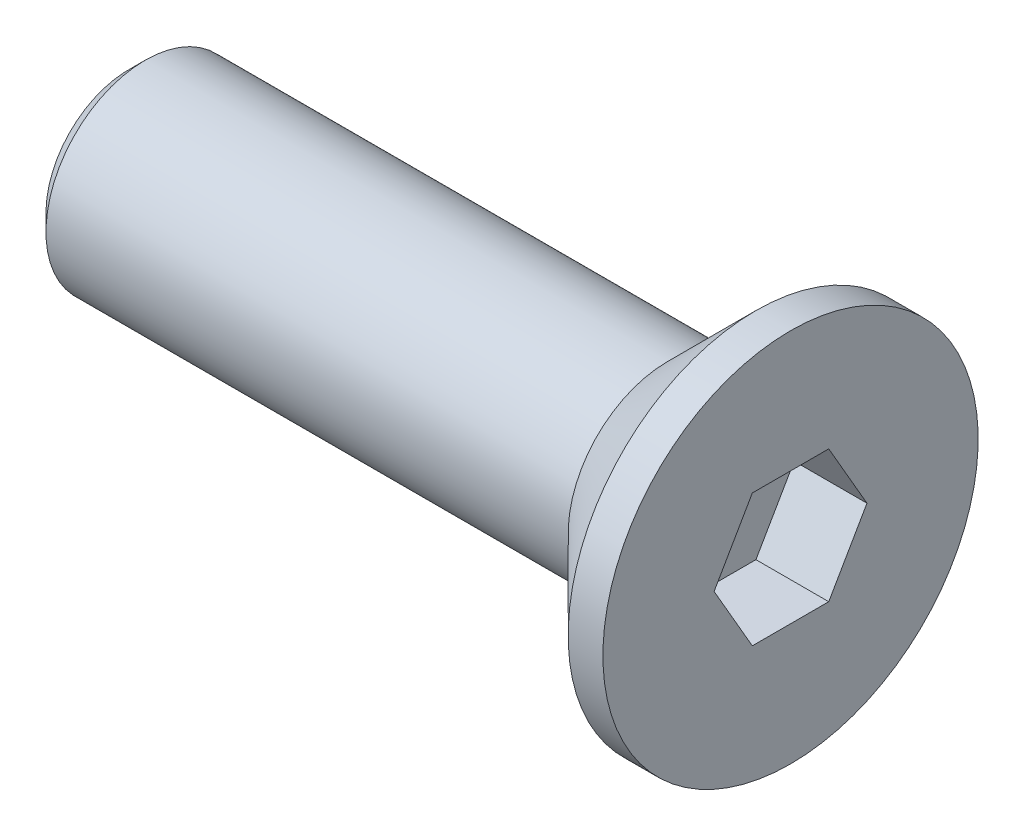
ISO-10303-21;
HEADER;
FILE_DESCRIPTION(('STEP AP214'),'2;1');
FILE_NAME('part.step','',(''),(''),'','','');
FILE_SCHEMA(('AUTOMOTIVE_DESIGN { 1 0 10303 214 1 1 1 1 }'));
ENDSEC;
DATA;
#1=APPLICATION_CONTEXT('core data for automotive mechanical design processes');
#2=APPLICATION_PROTOCOL_DEFINITION('international standard','automotive_design',2000,#1);
#3=PRODUCT_CONTEXT('',#1,'mechanical');
#4=PRODUCT('Part','Part','',(#3));
#5=PRODUCT_RELATED_PRODUCT_CATEGORY('part','',(#4));
#6=PRODUCT_DEFINITION_FORMATION('','',#4);
#7=PRODUCT_DEFINITION_CONTEXT('part definition',#1,'design');
#8=PRODUCT_DEFINITION('design','',#6,#7);
#9=PRODUCT_DEFINITION_SHAPE('','',#8);
#10=(LENGTH_UNIT() NAMED_UNIT(*) SI_UNIT(.MILLI.,.METRE.));
#11=(NAMED_UNIT(*) PLANE_ANGLE_UNIT() SI_UNIT($,.RADIAN.));
#12=(NAMED_UNIT(*) SI_UNIT($,.STERADIAN.) SOLID_ANGLE_UNIT());
#13=UNCERTAINTY_MEASURE_WITH_UNIT(LENGTH_MEASURE(1.E-05),#10,'distance_accuracy_value','');
#14=(GEOMETRIC_REPRESENTATION_CONTEXT(3) GLOBAL_UNCERTAINTY_ASSIGNED_CONTEXT((#13)) GLOBAL_UNIT_ASSIGNED_CONTEXT((#10,
#11,#12)) REPRESENTATION_CONTEXT('',''));
#15=CARTESIAN_POINT('',(0.,0.,0.));
#16=DIRECTION('',(0.,0.,1.));
#17=DIRECTION('',(1.,0.,0.));
#18=AXIS2_PLACEMENT_3D('',#15,#16,#17);
#19=CARTESIAN_POINT('',(0.,0.,0.));
#20=DIRECTION('',(1.,0.,0.));
#21=DIRECTION('',(0.,1.,0.));
#22=AXIS2_PLACEMENT_3D('',#19,#20,#21);
#23=PLANE('',#22);
#24=DIRECTION('',(0.,0.866025403784439,-0.5));
#25=VECTOR('',#24,1.);
#26=CARTESIAN_POINT('',(0.,-2.,-1.15470053837925));
#27=LINE('',#26,#25);
#28=CARTESIAN_POINT('',(0.,-2.,-1.15470053837925));
#29=VERTEX_POINT('',#28);
#30=CARTESIAN_POINT('',(0.,0.,-2.3094010767585));
#31=VERTEX_POINT('',#30);
#32=EDGE_CURVE('E49',#29,#31,#27,.T.);
#33=ORIENTED_EDGE('',*,*,#32,.F.);
#34=DIRECTION('',(0.,0.,-1.));
#35=VECTOR('',#34,1.);
#36=CARTESIAN_POINT('',(0.,-2.,1.15470053837925));
#37=LINE('',#36,#35);
#38=CARTESIAN_POINT('',(0.,-2.,1.15470053837925));
#39=VERTEX_POINT('',#38);
#40=EDGE_CURVE('E132',#39,#29,#37,.T.);
#41=ORIENTED_EDGE('',*,*,#40,.F.);
#42=DIRECTION('',(0.,-0.866025403784438,-0.5));
#43=VECTOR('',#42,1.);
#44=CARTESIAN_POINT('',(0.,0.,2.3094010767585));
#45=LINE('',#44,#43);
#46=CARTESIAN_POINT('',(0.,0.,2.3094010767585));
#47=VERTEX_POINT('',#46);
#48=EDGE_CURVE('E130',#47,#39,#45,.T.);
#49=ORIENTED_EDGE('',*,*,#48,.F.);
#50=DIRECTION('',(0.,-0.866025403784439,0.5));
#51=VECTOR('',#50,1.);
#52=CARTESIAN_POINT('',(0.,2.,1.15470053837925));
#53=LINE('',#52,#51);
#54=CARTESIAN_POINT('',(0.,2.,1.15470053837925));
#55=VERTEX_POINT('',#54);
#56=EDGE_CURVE('E97',#55,#47,#53,.T.);
#57=ORIENTED_EDGE('',*,*,#56,.F.);
#58=DIRECTION('',(0.,0.,1.));
#59=VECTOR('',#58,1.);
#60=CARTESIAN_POINT('',(0.,2.,-1.15470053837925));
#61=LINE('',#60,#59);
#62=CARTESIAN_POINT('',(0.,2.,-1.15470053837925));
#63=VERTEX_POINT('',#62);
#64=EDGE_CURVE('E126',#63,#55,#61,.T.);
#65=ORIENTED_EDGE('',*,*,#64,.F.);
#66=DIRECTION('',(0.,0.866025403784438,0.5));
#67=VECTOR('',#66,1.);
#68=CARTESIAN_POINT('',(0.,0.,-2.3094010767585));
#69=LINE('',#68,#67);
#70=EDGE_CURVE('E123',#31,#63,#69,.T.);
#71=ORIENTED_EDGE('',*,*,#70,.F.);
#72=EDGE_LOOP('',(#33,#41,#49,#57,#65,#71));
#73=FACE_BOUND('',#72,.T.);
#74=CARTESIAN_POINT('',(0.,0.,0.));
#75=DIRECTION('',(1.,0.,0.));
#76=DIRECTION('',(0.,1.,0.));
#77=AXIS2_PLACEMENT_3D('',#74,#75,#76);
#78=CIRCLE('',#77,5.67);
#79=CARTESIAN_POINT('',(0.,5.67,0.));
#80=VERTEX_POINT('',#79);
#81=EDGE_CURVE('E147',#80,#80,#78,.T.);
#82=ORIENTED_EDGE('',*,*,#81,.T.);
#83=EDGE_LOOP('',(#82));
#84=FACE_BOUND('',#83,.T.);
#85=ADVANCED_FACE('F34',(#73,#84),#23,.T.);
#86=CARTESIAN_POINT('',(0.,0.,0.));
#87=DIRECTION('',(1.,0.,0.));
#88=DIRECTION('',(0.,1.,0.));
#89=AXIS2_PLACEMENT_3D('',#86,#87,#88);
#90=CYLINDRICAL_SURFACE('',#89,5.67);
#91=CARTESIAN_POINT('',(-1.05000000000001,0.,0.));
#92=DIRECTION('',(1.,0.,0.));
#93=DIRECTION('',(0.,1.,0.));
#94=AXIS2_PLACEMENT_3D('',#91,#92,#93);
#95=CIRCLE('',#94,5.67);
#96=CARTESIAN_POINT('',(-1.05000000000001,5.67,0.));
#97=VERTEX_POINT('',#96);
#98=EDGE_CURVE('E144',#97,#97,#95,.T.);
#99=ORIENTED_EDGE('',*,*,#98,.T.);
#100=EDGE_LOOP('',(#99));
#101=FACE_BOUND('',#100,.T.);
#102=ORIENTED_EDGE('',*,*,#81,.F.);
#103=EDGE_LOOP('',(#102));
#104=FACE_BOUND('',#103,.T.);
#105=ADVANCED_FACE('F164',(#101,#104),#90,.T.);
#106=CARTESIAN_POINT('',(-1.05000000000001,0.,0.));
#107=DIRECTION('',(1.,0.,0.));
#108=DIRECTION('',(0.,1.,0.));
#109=AXIS2_PLACEMENT_3D('',#106,#107,#108);
#110=CONICAL_SURFACE('',#109,5.67,0.78539816339745);
#111=CARTESIAN_POINT('',(-3.72,0.,0.));
#112=DIRECTION('',(1.,0.,0.));
#113=DIRECTION('',(0.,1.,0.));
#114=AXIS2_PLACEMENT_3D('',#111,#112,#113);
#115=CIRCLE('',#114,3.);
#116=CARTESIAN_POINT('',(-3.72,3.,0.));
#117=VERTEX_POINT('',#116);
#118=EDGE_CURVE('E136',#117,#117,#115,.T.);
#119=ORIENTED_EDGE('',*,*,#118,.T.);
#120=EDGE_LOOP('',(#119));
#121=FACE_BOUND('',#120,.T.);
#122=ORIENTED_EDGE('',*,*,#98,.F.);
#123=EDGE_LOOP('',(#122));
#124=FACE_BOUND('',#123,.T.);
#125=ADVANCED_FACE('F169',(#121,#124),#110,.T.);
#126=CARTESIAN_POINT('',(0.,0.,0.));
#127=DIRECTION('',(1.,0.,0.));
#128=DIRECTION('',(0.,1.,0.));
#129=AXIS2_PLACEMENT_3D('',#126,#127,#128);
#130=CYLINDRICAL_SURFACE('',#129,3.);
#131=CARTESIAN_POINT('',(-19.5,0.,0.));
#132=DIRECTION('',(-1.,0.,0.));
#133=DIRECTION('',(0.,-1.,0.));
#134=AXIS2_PLACEMENT_3D('',#131,#132,#133);
#135=CIRCLE('',#134,3.);
#136=CARTESIAN_POINT('',(-19.5,-3.,0.));
#137=VERTEX_POINT('',#136);
#138=EDGE_CURVE('E42',#137,#137,#135,.F.);
#139=ORIENTED_EDGE('',*,*,#138,.T.);
#140=EDGE_LOOP('',(#139));
#141=FACE_BOUND('',#140,.T.);
#142=ORIENTED_EDGE('',*,*,#118,.F.);
#143=EDGE_LOOP('',(#142));
#144=FACE_BOUND('',#143,.T.);
#145=ADVANCED_FACE('F152',(#141,#144),#130,.T.);
#146=CARTESIAN_POINT('',(-20.,3.,0.));
#147=DIRECTION('',(-1.,0.,0.));
#148=DIRECTION('',(0.,-1.,0.));
#149=AXIS2_PLACEMENT_3D('',#146,#147,#148);
#150=PLANE('',#149);
#151=CARTESIAN_POINT('',(-20.,0.,0.));
#152=DIRECTION('',(-1.,0.,0.));
#153=DIRECTION('',(0.,-1.,0.));
#154=AXIS2_PLACEMENT_3D('',#151,#152,#153);
#155=CIRCLE('',#154,2.50000000000001);
#156=CARTESIAN_POINT('',(-20.,-2.50000000000001,0.));
#157=VERTEX_POINT('',#156);
#158=EDGE_CURVE('E11',#157,#157,#155,.T.);
#159=ORIENTED_EDGE('',*,*,#158,.T.);
#160=EDGE_LOOP('',(#159));
#161=FACE_BOUND('',#160,.T.);
#162=ADVANCED_FACE('F179',(#161),#150,.T.);
#163=CARTESIAN_POINT('',(-2.2,-2.,-1.15470053837925));
#164=DIRECTION('',(0.,-0.5,-0.866025403784439));
#165=DIRECTION('',(0.,0.866025403784439,-0.5));
#166=AXIS2_PLACEMENT_3D('',#163,#164,#165);
#167=PLANE('',#166);
#168=ORIENTED_EDGE('',*,*,#32,.T.);
#169=DIRECTION('',(1.,0.,0.));
#170=VECTOR('',#169,1.);
#171=CARTESIAN_POINT('',(-2.2,0.,-2.3094010767585));
#172=LINE('',#171,#170);
#173=CARTESIAN_POINT('',(-2.2,0.,-2.3094010767585));
#174=VERTEX_POINT('',#173);
#175=EDGE_CURVE('E79',#174,#31,#172,.T.);
#176=ORIENTED_EDGE('',*,*,#175,.F.);
#177=DIRECTION('',(0.,0.866025403784439,-0.5));
#178=VECTOR('',#177,1.);
#179=CARTESIAN_POINT('',(-2.2,-2.,-1.15470053837925));
#180=LINE('',#179,#178);
#181=CARTESIAN_POINT('',(-2.2,-2.,-1.15470053837925));
#182=VERTEX_POINT('',#181);
#183=EDGE_CURVE('E134',#182,#174,#180,.T.);
#184=ORIENTED_EDGE('',*,*,#183,.F.);
#185=DIRECTION('',(1.,0.,0.));
#186=VECTOR('',#185,1.);
#187=CARTESIAN_POINT('',(-2.2,-2.,-1.15470053837925));
#188=LINE('',#187,#186);
#189=EDGE_CURVE('E57',#182,#29,#188,.T.);
#190=ORIENTED_EDGE('',*,*,#189,.T.);
#191=EDGE_LOOP('',(#168,#176,#184,#190));
#192=FACE_BOUND('',#191,.T.);
#193=ADVANCED_FACE('F182',(#192),#167,.F.);
#194=CARTESIAN_POINT('',(-2.2,-2.,1.15470053837925));
#195=DIRECTION('',(0.,-1.,0.));
#196=DIRECTION('',(0.,0.,-1.));
#197=AXIS2_PLACEMENT_3D('',#194,#195,#196);
#198=PLANE('',#197);
#199=ORIENTED_EDGE('',*,*,#40,.T.);
#200=ORIENTED_EDGE('',*,*,#189,.F.);
#201=DIRECTION('',(0.,0.,-1.));
#202=VECTOR('',#201,1.);
#203=CARTESIAN_POINT('',(-2.2,-2.,1.15470053837925));
#204=LINE('',#203,#202);
#205=CARTESIAN_POINT('',(-2.2,-2.,1.15470053837925));
#206=VERTEX_POINT('',#205);
#207=EDGE_CURVE('E109',#206,#182,#204,.T.);
#208=ORIENTED_EDGE('',*,*,#207,.F.);
#209=DIRECTION('',(1.,0.,0.));
#210=VECTOR('',#209,1.);
#211=CARTESIAN_POINT('',(-2.2,-2.,1.15470053837925));
#212=LINE('',#211,#210);
#213=EDGE_CURVE('E101',#206,#39,#212,.T.);
#214=ORIENTED_EDGE('',*,*,#213,.T.);
#215=EDGE_LOOP('',(#199,#200,#208,#214));
#216=FACE_BOUND('',#215,.T.);
#217=ADVANCED_FACE('F186',(#216),#198,.F.);
#218=CARTESIAN_POINT('',(-2.2,0.,2.3094010767585));
#219=DIRECTION('',(0.,-0.5,0.866025403784439));
#220=DIRECTION('',(0.,-0.866025403784438,-0.5));
#221=AXIS2_PLACEMENT_3D('',#218,#219,#220);
#222=PLANE('',#221);
#223=ORIENTED_EDGE('',*,*,#48,.T.);
#224=ORIENTED_EDGE('',*,*,#213,.F.);
#225=DIRECTION('',(0.,-0.866025403784438,-0.5));
#226=VECTOR('',#225,1.);
#227=CARTESIAN_POINT('',(-2.2,0.,2.3094010767585));
#228=LINE('',#227,#226);
#229=CARTESIAN_POINT('',(-2.2,0.,2.3094010767585));
#230=VERTEX_POINT('',#229);
#231=EDGE_CURVE('E105',#230,#206,#228,.T.);
#232=ORIENTED_EDGE('',*,*,#231,.F.);
#233=DIRECTION('',(1.,0.,0.));
#234=VECTOR('',#233,1.);
#235=CARTESIAN_POINT('',(-2.2,0.,2.3094010767585));
#236=LINE('',#235,#234);
#237=EDGE_CURVE('E90',#230,#47,#236,.T.);
#238=ORIENTED_EDGE('',*,*,#237,.T.);
#239=EDGE_LOOP('',(#223,#224,#232,#238));
#240=FACE_BOUND('',#239,.T.);
#241=ADVANCED_FACE('F106',(#240),#222,.F.);
#242=CARTESIAN_POINT('',(-2.2,2.,1.15470053837925));
#243=DIRECTION('',(0.,0.5,0.866025403784439));
#244=DIRECTION('',(0.,-0.866025403784439,0.5));
#245=AXIS2_PLACEMENT_3D('',#242,#243,#244);
#246=PLANE('',#245);
#247=ORIENTED_EDGE('',*,*,#56,.T.);
#248=ORIENTED_EDGE('',*,*,#237,.F.);
#249=DIRECTION('',(0.,-0.866025403784439,0.5));
#250=VECTOR('',#249,1.);
#251=CARTESIAN_POINT('',(-2.2,2.,1.15470053837925));
#252=LINE('',#251,#250);
#253=CARTESIAN_POINT('',(-2.2,2.,1.15470053837925));
#254=VERTEX_POINT('',#253);
#255=EDGE_CURVE('E94',#254,#230,#252,.T.);
#256=ORIENTED_EDGE('',*,*,#255,.F.);
#257=DIRECTION('',(1.,0.,0.));
#258=VECTOR('',#257,1.);
#259=CARTESIAN_POINT('',(-2.2,2.,1.15470053837925));
#260=LINE('',#259,#258);
#261=EDGE_CURVE('E102',#254,#55,#260,.T.);
#262=ORIENTED_EDGE('',*,*,#261,.T.);
#263=EDGE_LOOP('',(#247,#248,#256,#262));
#264=FACE_BOUND('',#263,.T.);
#265=ADVANCED_FACE('F92',(#264),#246,.F.);
#266=CARTESIAN_POINT('',(-2.2,2.,-1.15470053837925));
#267=DIRECTION('',(0.,1.,0.));
#268=DIRECTION('',(-1.,0.,0.));
#269=AXIS2_PLACEMENT_3D('',#266,#267,#268);
#270=PLANE('',#269);
#271=ORIENTED_EDGE('',*,*,#64,.T.);
#272=ORIENTED_EDGE('',*,*,#261,.F.);
#273=DIRECTION('',(0.,0.,1.));
#274=VECTOR('',#273,1.);
#275=CARTESIAN_POINT('',(-2.2,2.,-1.15470053837925));
#276=LINE('',#275,#274);
#277=CARTESIAN_POINT('',(-2.2,2.,-1.15470053837925));
#278=VERTEX_POINT('',#277);
#279=EDGE_CURVE('E115',#278,#254,#276,.T.);
#280=ORIENTED_EDGE('',*,*,#279,.F.);
#281=DIRECTION('',(1.,0.,0.));
#282=VECTOR('',#281,1.);
#283=CARTESIAN_POINT('',(-2.2,2.,-1.15470053837925));
#284=LINE('',#283,#282);
#285=EDGE_CURVE('E139',#278,#63,#284,.T.);
#286=ORIENTED_EDGE('',*,*,#285,.T.);
#287=EDGE_LOOP('',(#271,#272,#280,#286));
#288=FACE_BOUND('',#287,.T.);
#289=ADVANCED_FACE('F189',(#288),#270,.F.);
#290=CARTESIAN_POINT('',(-2.2,0.,-2.3094010767585));
#291=DIRECTION('',(0.,0.5,-0.866025403784439));
#292=DIRECTION('',(0.,0.866025403784438,0.5));
#293=AXIS2_PLACEMENT_3D('',#290,#291,#292);
#294=PLANE('',#293);
#295=ORIENTED_EDGE('',*,*,#70,.T.);
#296=ORIENTED_EDGE('',*,*,#285,.F.);
#297=DIRECTION('',(0.,0.866025403784438,0.5));
#298=VECTOR('',#297,1.);
#299=CARTESIAN_POINT('',(-2.2,0.,-2.3094010767585));
#300=LINE('',#299,#298);
#301=EDGE_CURVE('E117',#174,#278,#300,.T.);
#302=ORIENTED_EDGE('',*,*,#301,.F.);
#303=ORIENTED_EDGE('',*,*,#175,.T.);
#304=EDGE_LOOP('',(#295,#296,#302,#303));
#305=FACE_BOUND('',#304,.T.);
#306=ADVANCED_FACE('F160',(#305),#294,.F.);
#307=CARTESIAN_POINT('',(-2.2,0.,-2.3094010767585));
#308=DIRECTION('',(1.,0.,0.));
#309=DIRECTION('',(0.,1.,0.));
#310=AXIS2_PLACEMENT_3D('',#307,#308,#309);
#311=PLANE('',#310);
#312=ORIENTED_EDGE('',*,*,#183,.T.);
#313=ORIENTED_EDGE('',*,*,#301,.T.);
#314=ORIENTED_EDGE('',*,*,#279,.T.);
#315=ORIENTED_EDGE('',*,*,#255,.T.);
#316=ORIENTED_EDGE('',*,*,#231,.T.);
#317=ORIENTED_EDGE('',*,*,#207,.T.);
#318=EDGE_LOOP('',(#312,#313,#314,#315,#316,#317));
#319=FACE_BOUND('',#318,.T.);
#320=ADVANCED_FACE('F112',(#319),#311,.T.);
#321=CARTESIAN_POINT('',(-19.5,0.,0.));
#322=DIRECTION('',(1.,0.,0.));
#323=DIRECTION('',(0.,1.,0.));
#324=AXIS2_PLACEMENT_3D('',#321,#322,#323);
#325=CONICAL_SURFACE('',#324,3.,0.785398163397445);
#326=ORIENTED_EDGE('',*,*,#158,.F.);
#327=EDGE_LOOP('',(#326));
#328=FACE_BOUND('',#327,.T.);
#329=ORIENTED_EDGE('',*,*,#138,.F.);
#330=EDGE_LOOP('',(#329));
#331=FACE_BOUND('',#330,.T.);
#332=ADVANCED_FACE('F36',(#328,#331),#325,.T.);
#333=CLOSED_SHELL('',(#85,#105,#125,#145,#162,#193,#217,#241,#265,#289,#306,#320,#332));
#334=MANIFOLD_SOLID_BREP('B2',#333);
#335=ADVANCED_BREP_SHAPE_REPRESENTATION('',(#18,#334),#14);
#336=SHAPE_DEFINITION_REPRESENTATION(#9,#335);
ENDSEC;
END-ISO-10303-21;
